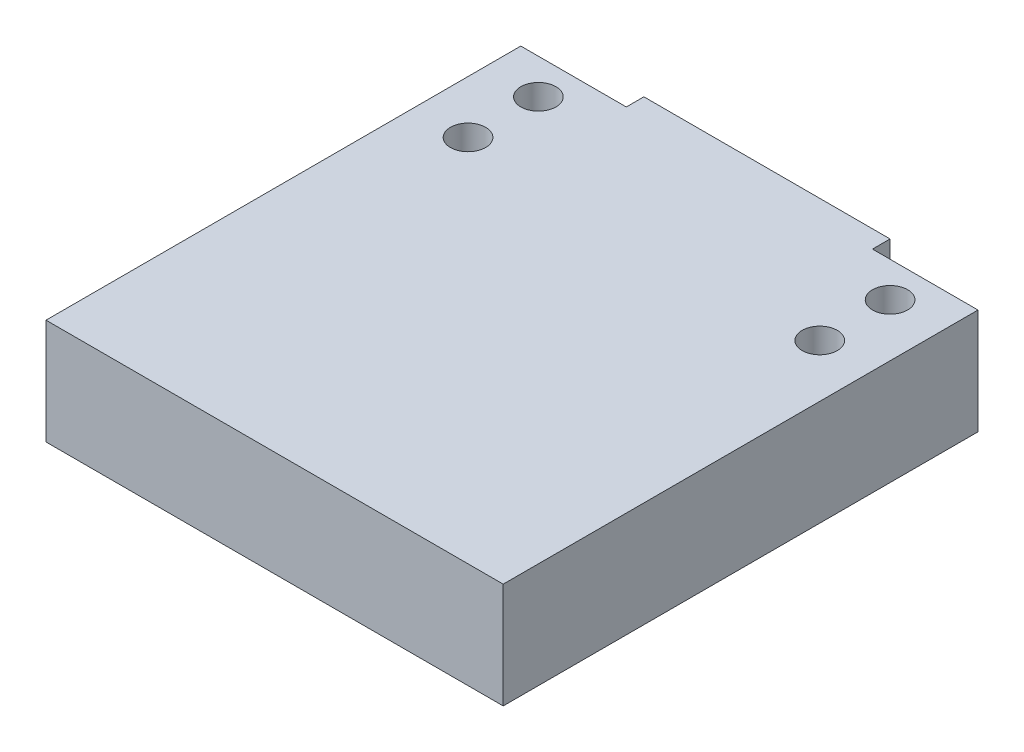
ISO-10303-21;
HEADER;
FILE_DESCRIPTION(('STEP AP214'),'2;1');
FILE_NAME('part.step','',(''),(''),'','','');
FILE_SCHEMA(('AUTOMOTIVE_DESIGN { 1 0 10303 214 1 1 1 1 }'));
ENDSEC;
DATA;
#1=APPLICATION_CONTEXT('core data for automotive mechanical design processes');
#2=APPLICATION_PROTOCOL_DEFINITION('international standard','automotive_design',2000,#1);
#3=PRODUCT_CONTEXT('',#1,'mechanical');
#4=PRODUCT('Part','Part','',(#3));
#5=PRODUCT_RELATED_PRODUCT_CATEGORY('part','',(#4));
#6=PRODUCT_DEFINITION_FORMATION('','',#4);
#7=PRODUCT_DEFINITION_CONTEXT('part definition',#1,'design');
#8=PRODUCT_DEFINITION('design','',#6,#7);
#9=PRODUCT_DEFINITION_SHAPE('','',#8);
#10=(LENGTH_UNIT() NAMED_UNIT(*) SI_UNIT(.MILLI.,.METRE.));
#11=(NAMED_UNIT(*) PLANE_ANGLE_UNIT() SI_UNIT($,.RADIAN.));
#12=(NAMED_UNIT(*) SI_UNIT($,.STERADIAN.) SOLID_ANGLE_UNIT());
#13=UNCERTAINTY_MEASURE_WITH_UNIT(LENGTH_MEASURE(1.E-05),#10,'distance_accuracy_value','');
#14=(GEOMETRIC_REPRESENTATION_CONTEXT(3) GLOBAL_UNCERTAINTY_ASSIGNED_CONTEXT((#13)) GLOBAL_UNIT_ASSIGNED_CONTEXT((#10,
#11,#12)) REPRESENTATION_CONTEXT('',''));
#15=CARTESIAN_POINT('',(0.,0.,0.));
#16=DIRECTION('',(0.,0.,1.));
#17=DIRECTION('',(1.,0.,0.));
#18=AXIS2_PLACEMENT_3D('',#15,#16,#17);
#19=CARTESIAN_POINT('',(0.,6.,0.));
#20=DIRECTION('',(1.,0.,0.));
#21=DIRECTION('',(0.,0.,-1.));
#22=AXIS2_PLACEMENT_3D('',#19,#20,#21);
#23=PLANE('',#22);
#24=DIRECTION('',(0.,0.,1.));
#25=VECTOR('',#24,1.);
#26=CARTESIAN_POINT('',(0.,0.,0.));
#27=LINE('',#26,#25);
#28=CARTESIAN_POINT('',(0.,0.,-27.));
#29=VERTEX_POINT('',#28);
#30=CARTESIAN_POINT('',(0.,0.,0.));
#31=VERTEX_POINT('',#30);
#32=EDGE_CURVE('E131',#29,#31,#27,.T.);
#33=ORIENTED_EDGE('',*,*,#32,.T.);
#34=DIRECTION('',(0.,-1.,0.));
#35=VECTOR('',#34,1.);
#36=CARTESIAN_POINT('',(0.,6.,0.));
#37=LINE('',#36,#35);
#38=CARTESIAN_POINT('',(0.,6.,0.));
#39=VERTEX_POINT('',#38);
#40=EDGE_CURVE('E11',#39,#31,#37,.T.);
#41=ORIENTED_EDGE('',*,*,#40,.F.);
#42=DIRECTION('',(0.,0.,1.));
#43=VECTOR('',#42,1.);
#44=CARTESIAN_POINT('',(0.,6.,0.));
#45=LINE('',#44,#43);
#46=CARTESIAN_POINT('',(0.,6.,-27.));
#47=VERTEX_POINT('',#46);
#48=EDGE_CURVE('E146',#47,#39,#45,.T.);
#49=ORIENTED_EDGE('',*,*,#48,.F.);
#50=DIRECTION('',(0.,-1.,0.));
#51=VECTOR('',#50,1.);
#52=CARTESIAN_POINT('',(0.,6.,-27.));
#53=LINE('',#52,#51);
#54=EDGE_CURVE('E127',#47,#29,#53,.T.);
#55=ORIENTED_EDGE('',*,*,#54,.T.);
#56=EDGE_LOOP('',(#33,#41,#49,#55));
#57=FACE_BOUND('',#56,.T.);
#58=ADVANCED_FACE('F35',(#57),#23,.F.);
#59=CARTESIAN_POINT('',(0.,6.,0.));
#60=DIRECTION('',(0.,0.,-1.));
#61=DIRECTION('',(-1.,0.,0.));
#62=AXIS2_PLACEMENT_3D('',#59,#60,#61);
#63=PLANE('',#62);
#64=DIRECTION('',(1.,0.,0.));
#65=VECTOR('',#64,1.);
#66=CARTESIAN_POINT('',(0.,0.,0.));
#67=LINE('',#66,#65);
#68=CARTESIAN_POINT('',(26.,0.,0.));
#69=VERTEX_POINT('',#68);
#70=EDGE_CURVE('E134',#31,#69,#67,.T.);
#71=ORIENTED_EDGE('',*,*,#70,.T.);
#72=DIRECTION('',(0.,-1.,0.));
#73=VECTOR('',#72,1.);
#74=CARTESIAN_POINT('',(26.,6.,0.));
#75=LINE('',#74,#73);
#76=CARTESIAN_POINT('',(26.,6.,0.));
#77=VERTEX_POINT('',#76);
#78=EDGE_CURVE('E43',#77,#69,#75,.T.);
#79=ORIENTED_EDGE('',*,*,#78,.F.);
#80=DIRECTION('',(1.,0.,0.));
#81=VECTOR('',#80,1.);
#82=CARTESIAN_POINT('',(0.,6.,0.));
#83=LINE('',#82,#81);
#84=EDGE_CURVE('E94',#39,#77,#83,.T.);
#85=ORIENTED_EDGE('',*,*,#84,.F.);
#86=ORIENTED_EDGE('',*,*,#40,.T.);
#87=EDGE_LOOP('',(#71,#79,#85,#86));
#88=FACE_BOUND('',#87,.T.);
#89=ADVANCED_FACE('F236',(#88),#63,.F.);
#90=CARTESIAN_POINT('',(26.,6.,0.));
#91=DIRECTION('',(-1.,0.,0.));
#92=DIRECTION('',(0.,0.,1.));
#93=AXIS2_PLACEMENT_3D('',#90,#91,#92);
#94=PLANE('',#93);
#95=DIRECTION('',(0.,0.,-1.));
#96=VECTOR('',#95,1.);
#97=CARTESIAN_POINT('',(26.,0.,0.));
#98=LINE('',#97,#96);
#99=CARTESIAN_POINT('',(26.,0.,-27.));
#100=VERTEX_POINT('',#99);
#101=EDGE_CURVE('E137',#69,#100,#98,.T.);
#102=ORIENTED_EDGE('',*,*,#101,.T.);
#103=DIRECTION('',(0.,-1.,0.));
#104=VECTOR('',#103,1.);
#105=CARTESIAN_POINT('',(26.,6.,-27.));
#106=LINE('',#105,#104);
#107=CARTESIAN_POINT('',(26.,6.,-27.));
#108=VERTEX_POINT('',#107);
#109=EDGE_CURVE('E153',#108,#100,#106,.T.);
#110=ORIENTED_EDGE('',*,*,#109,.F.);
#111=DIRECTION('',(0.,0.,-1.));
#112=VECTOR('',#111,1.);
#113=CARTESIAN_POINT('',(26.,6.,0.));
#114=LINE('',#113,#112);
#115=EDGE_CURVE('E161',#77,#108,#114,.T.);
#116=ORIENTED_EDGE('',*,*,#115,.F.);
#117=ORIENTED_EDGE('',*,*,#78,.T.);
#118=EDGE_LOOP('',(#102,#110,#116,#117));
#119=FACE_BOUND('',#118,.T.);
#120=ADVANCED_FACE('F159',(#119),#94,.F.);
#121=CARTESIAN_POINT('',(20.,6.,-27.));
#122=DIRECTION('',(0.,0.,1.));
#123=DIRECTION('',(1.,0.,0.));
#124=AXIS2_PLACEMENT_3D('',#121,#122,#123);
#125=PLANE('',#124);
#126=DIRECTION('',(-1.,0.,0.));
#127=VECTOR('',#126,1.);
#128=CARTESIAN_POINT('',(20.,0.,-27.));
#129=LINE('',#128,#127);
#130=CARTESIAN_POINT('',(20.,0.,-27.));
#131=VERTEX_POINT('',#130);
#132=EDGE_CURVE('E139',#100,#131,#129,.T.);
#133=ORIENTED_EDGE('',*,*,#132,.T.);
#134=DIRECTION('',(0.,-1.,0.));
#135=VECTOR('',#134,1.);
#136=CARTESIAN_POINT('',(20.,6.,-27.));
#137=LINE('',#136,#135);
#138=CARTESIAN_POINT('',(20.,6.,-27.));
#139=VERTEX_POINT('',#138);
#140=EDGE_CURVE('E150',#139,#131,#137,.T.);
#141=ORIENTED_EDGE('',*,*,#140,.F.);
#142=DIRECTION('',(-1.,0.,0.));
#143=VECTOR('',#142,1.);
#144=CARTESIAN_POINT('',(20.,6.,-27.));
#145=LINE('',#144,#143);
#146=EDGE_CURVE('E173',#108,#139,#145,.T.);
#147=ORIENTED_EDGE('',*,*,#146,.F.);
#148=ORIENTED_EDGE('',*,*,#109,.T.);
#149=EDGE_LOOP('',(#133,#141,#147,#148));
#150=FACE_BOUND('',#149,.T.);
#151=ADVANCED_FACE('F169',(#150),#125,.F.);
#152=CARTESIAN_POINT('',(20.,6.,-28.));
#153=DIRECTION('',(-1.,0.,0.));
#154=DIRECTION('',(0.,0.,1.));
#155=AXIS2_PLACEMENT_3D('',#152,#153,#154);
#156=PLANE('',#155);
#157=DIRECTION('',(0.,0.,-1.));
#158=VECTOR('',#157,1.);
#159=CARTESIAN_POINT('',(20.,0.,-28.));
#160=LINE('',#159,#158);
#161=CARTESIAN_POINT('',(20.,0.,-28.));
#162=VERTEX_POINT('',#161);
#163=EDGE_CURVE('E141',#131,#162,#160,.T.);
#164=ORIENTED_EDGE('',*,*,#163,.T.);
#165=DIRECTION('',(0.,-1.,0.));
#166=VECTOR('',#165,1.);
#167=CARTESIAN_POINT('',(20.,6.,-28.));
#168=LINE('',#167,#166);
#169=CARTESIAN_POINT('',(20.,6.,-28.));
#170=VERTEX_POINT('',#169);
#171=EDGE_CURVE('E122',#170,#162,#168,.T.);
#172=ORIENTED_EDGE('',*,*,#171,.F.);
#173=DIRECTION('',(0.,0.,-1.));
#174=VECTOR('',#173,1.);
#175=CARTESIAN_POINT('',(20.,6.,-28.));
#176=LINE('',#175,#174);
#177=EDGE_CURVE('E113',#139,#170,#176,.T.);
#178=ORIENTED_EDGE('',*,*,#177,.F.);
#179=ORIENTED_EDGE('',*,*,#140,.T.);
#180=EDGE_LOOP('',(#164,#172,#178,#179));
#181=FACE_BOUND('',#180,.T.);
#182=ADVANCED_FACE('F172',(#181),#156,.F.);
#183=CARTESIAN_POINT('',(6.,6.,-28.));
#184=DIRECTION('',(0.,0.,1.));
#185=DIRECTION('',(1.,0.,0.));
#186=AXIS2_PLACEMENT_3D('',#183,#184,#185);
#187=PLANE('',#186);
#188=DIRECTION('',(-1.,0.,0.));
#189=VECTOR('',#188,1.);
#190=CARTESIAN_POINT('',(6.,0.,-28.));
#191=LINE('',#190,#189);
#192=CARTESIAN_POINT('',(6.,0.,-28.));
#193=VERTEX_POINT('',#192);
#194=EDGE_CURVE('E121',#162,#193,#191,.T.);
#195=ORIENTED_EDGE('',*,*,#194,.T.);
#196=DIRECTION('',(0.,-1.,0.));
#197=VECTOR('',#196,1.);
#198=CARTESIAN_POINT('',(6.,6.,-28.));
#199=LINE('',#198,#197);
#200=CARTESIAN_POINT('',(6.,6.,-28.));
#201=VERTEX_POINT('',#200);
#202=EDGE_CURVE('E118',#201,#193,#199,.T.);
#203=ORIENTED_EDGE('',*,*,#202,.F.);
#204=DIRECTION('',(-1.,0.,0.));
#205=VECTOR('',#204,1.);
#206=CARTESIAN_POINT('',(6.,6.,-28.));
#207=LINE('',#206,#205);
#208=EDGE_CURVE('E107',#170,#201,#207,.T.);
#209=ORIENTED_EDGE('',*,*,#208,.F.);
#210=ORIENTED_EDGE('',*,*,#171,.T.);
#211=EDGE_LOOP('',(#195,#203,#209,#210));
#212=FACE_BOUND('',#211,.T.);
#213=ADVANCED_FACE('F119',(#212),#187,.F.);
#214=CARTESIAN_POINT('',(6.,6.,-27.));
#215=DIRECTION('',(1.,0.,0.));
#216=DIRECTION('',(0.,0.,-1.));
#217=AXIS2_PLACEMENT_3D('',#214,#215,#216);
#218=PLANE('',#217);
#219=DIRECTION('',(0.,0.,1.));
#220=VECTOR('',#219,1.);
#221=CARTESIAN_POINT('',(6.,0.,-27.));
#222=LINE('',#221,#220);
#223=CARTESIAN_POINT('',(6.,0.,-27.));
#224=VERTEX_POINT('',#223);
#225=EDGE_CURVE('E80',#193,#224,#222,.T.);
#226=ORIENTED_EDGE('',*,*,#225,.T.);
#227=DIRECTION('',(0.,-1.,0.));
#228=VECTOR('',#227,1.);
#229=CARTESIAN_POINT('',(6.,6.,-27.));
#230=LINE('',#229,#228);
#231=CARTESIAN_POINT('',(6.,6.,-27.));
#232=VERTEX_POINT('',#231);
#233=EDGE_CURVE('E123',#232,#224,#230,.T.);
#234=ORIENTED_EDGE('',*,*,#233,.F.);
#235=DIRECTION('',(0.,0.,1.));
#236=VECTOR('',#235,1.);
#237=CARTESIAN_POINT('',(6.,6.,-27.));
#238=LINE('',#237,#236);
#239=EDGE_CURVE('E111',#201,#232,#238,.T.);
#240=ORIENTED_EDGE('',*,*,#239,.F.);
#241=ORIENTED_EDGE('',*,*,#202,.T.);
#242=EDGE_LOOP('',(#226,#234,#240,#241));
#243=FACE_BOUND('',#242,.T.);
#244=ADVANCED_FACE('F125',(#243),#218,.F.);
#245=CARTESIAN_POINT('',(0.,6.,-27.));
#246=DIRECTION('',(0.,0.,1.));
#247=DIRECTION('',(1.,0.,0.));
#248=AXIS2_PLACEMENT_3D('',#245,#246,#247);
#249=PLANE('',#248);
#250=DIRECTION('',(-1.,0.,0.));
#251=VECTOR('',#250,1.);
#252=CARTESIAN_POINT('',(0.,0.,-27.));
#253=LINE('',#252,#251);
#254=EDGE_CURVE('E86',#224,#29,#253,.T.);
#255=ORIENTED_EDGE('',*,*,#254,.T.);
#256=ORIENTED_EDGE('',*,*,#54,.F.);
#257=DIRECTION('',(-1.,0.,0.));
#258=VECTOR('',#257,1.);
#259=CARTESIAN_POINT('',(0.,6.,-27.));
#260=LINE('',#259,#258);
#261=EDGE_CURVE('E51',#232,#47,#260,.T.);
#262=ORIENTED_EDGE('',*,*,#261,.F.);
#263=ORIENTED_EDGE('',*,*,#233,.T.);
#264=EDGE_LOOP('',(#255,#256,#262,#263));
#265=FACE_BOUND('',#264,.T.);
#266=ADVANCED_FACE('F214',(#265),#249,.F.);
#267=CARTESIAN_POINT('',(0.,6.,0.));
#268=DIRECTION('',(0.,-1.,0.));
#269=DIRECTION('',(0.,0.,-1.));
#270=AXIS2_PLACEMENT_3D('',#267,#268,#269);
#271=PLANE('',#270);
#272=CARTESIAN_POINT('',(23.,6.,-21.));
#273=DIRECTION('',(0.,1.,0.));
#274=DIRECTION('',(0.,0.,1.));
#275=AXIS2_PLACEMENT_3D('',#272,#273,#274);
#276=CIRCLE('',#275,1.);
#277=CARTESIAN_POINT('',(23.,6.,-20.));
#278=VERTEX_POINT('',#277);
#279=EDGE_CURVE('E197',#278,#278,#276,.T.);
#280=ORIENTED_EDGE('',*,*,#279,.F.);
#281=EDGE_LOOP('',(#280));
#282=FACE_BOUND('',#281,.T.);
#283=CARTESIAN_POINT('',(3.,6.,-21.));
#284=DIRECTION('',(0.,1.,0.));
#285=DIRECTION('',(0.,0.,1.));
#286=AXIS2_PLACEMENT_3D('',#283,#284,#285);
#287=CIRCLE('',#286,1.);
#288=CARTESIAN_POINT('',(3.,6.,-20.));
#289=VERTEX_POINT('',#288);
#290=EDGE_CURVE('E191',#289,#289,#287,.T.);
#291=ORIENTED_EDGE('',*,*,#290,.F.);
#292=EDGE_LOOP('',(#291));
#293=FACE_BOUND('',#292,.T.);
#294=CARTESIAN_POINT('',(23.,6.,-25.));
#295=DIRECTION('',(0.,1.,0.));
#296=DIRECTION('',(0.,0.,1.));
#297=AXIS2_PLACEMENT_3D('',#294,#295,#296);
#298=CIRCLE('',#297,1.);
#299=CARTESIAN_POINT('',(23.,6.,-24.));
#300=VERTEX_POINT('',#299);
#301=EDGE_CURVE('E185',#300,#300,#298,.T.);
#302=ORIENTED_EDGE('',*,*,#301,.F.);
#303=EDGE_LOOP('',(#302));
#304=FACE_BOUND('',#303,.T.);
#305=CARTESIAN_POINT('',(3.,6.,-25.));
#306=DIRECTION('',(0.,1.,0.));
#307=DIRECTION('',(0.,0.,1.));
#308=AXIS2_PLACEMENT_3D('',#305,#306,#307);
#309=CIRCLE('',#308,1.);
#310=CARTESIAN_POINT('',(3.,6.,-24.));
#311=VERTEX_POINT('',#310);
#312=EDGE_CURVE('E179',#311,#311,#309,.T.);
#313=ORIENTED_EDGE('',*,*,#312,.F.);
#314=EDGE_LOOP('',(#313));
#315=FACE_BOUND('',#314,.T.);
#316=ORIENTED_EDGE('',*,*,#48,.T.);
#317=ORIENTED_EDGE('',*,*,#84,.T.);
#318=ORIENTED_EDGE('',*,*,#115,.T.);
#319=ORIENTED_EDGE('',*,*,#146,.T.);
#320=ORIENTED_EDGE('',*,*,#177,.T.);
#321=ORIENTED_EDGE('',*,*,#208,.T.);
#322=ORIENTED_EDGE('',*,*,#239,.T.);
#323=ORIENTED_EDGE('',*,*,#261,.T.);
#324=EDGE_LOOP('',(#316,#317,#318,#319,#320,#321,#322,#323));
#325=FACE_BOUND('',#324,.T.);
#326=ADVANCED_FACE('F109',(#282,#293,#304,#315,#325),#271,.F.);
#327=CARTESIAN_POINT('',(0.,0.,0.));
#328=DIRECTION('',(0.,-1.,0.));
#329=DIRECTION('',(0.,0.,-1.));
#330=AXIS2_PLACEMENT_3D('',#327,#328,#329);
#331=PLANE('',#330);
#332=CARTESIAN_POINT('',(23.,0.,-21.));
#333=DIRECTION('',(0.,1.,0.));
#334=DIRECTION('',(0.,0.,1.));
#335=AXIS2_PLACEMENT_3D('',#332,#333,#334);
#336=CIRCLE('',#335,1.);
#337=CARTESIAN_POINT('',(23.,0.,-20.));
#338=VERTEX_POINT('',#337);
#339=EDGE_CURVE('E194',#338,#338,#336,.T.);
#340=ORIENTED_EDGE('',*,*,#339,.T.);
#341=EDGE_LOOP('',(#340));
#342=FACE_BOUND('',#341,.T.);
#343=CARTESIAN_POINT('',(3.,0.,-21.));
#344=DIRECTION('',(0.,1.,0.));
#345=DIRECTION('',(0.,0.,1.));
#346=AXIS2_PLACEMENT_3D('',#343,#344,#345);
#347=CIRCLE('',#346,1.);
#348=CARTESIAN_POINT('',(3.,0.,-20.));
#349=VERTEX_POINT('',#348);
#350=EDGE_CURVE('E188',#349,#349,#347,.T.);
#351=ORIENTED_EDGE('',*,*,#350,.T.);
#352=EDGE_LOOP('',(#351));
#353=FACE_BOUND('',#352,.T.);
#354=CARTESIAN_POINT('',(23.,0.,-25.));
#355=DIRECTION('',(0.,1.,0.));
#356=DIRECTION('',(0.,0.,1.));
#357=AXIS2_PLACEMENT_3D('',#354,#355,#356);
#358=CIRCLE('',#357,1.);
#359=CARTESIAN_POINT('',(23.,0.,-24.));
#360=VERTEX_POINT('',#359);
#361=EDGE_CURVE('E182',#360,#360,#358,.T.);
#362=ORIENTED_EDGE('',*,*,#361,.T.);
#363=EDGE_LOOP('',(#362));
#364=FACE_BOUND('',#363,.T.);
#365=CARTESIAN_POINT('',(3.,0.,-25.));
#366=DIRECTION('',(0.,1.,0.));
#367=DIRECTION('',(0.,0.,1.));
#368=AXIS2_PLACEMENT_3D('',#365,#366,#367);
#369=CIRCLE('',#368,1.);
#370=CARTESIAN_POINT('',(3.,0.,-24.));
#371=VERTEX_POINT('',#370);
#372=EDGE_CURVE('E135',#371,#371,#369,.T.);
#373=ORIENTED_EDGE('',*,*,#372,.T.);
#374=EDGE_LOOP('',(#373));
#375=FACE_BOUND('',#374,.T.);
#376=ORIENTED_EDGE('',*,*,#32,.F.);
#377=ORIENTED_EDGE('',*,*,#254,.F.);
#378=ORIENTED_EDGE('',*,*,#225,.F.);
#379=ORIENTED_EDGE('',*,*,#194,.F.);
#380=ORIENTED_EDGE('',*,*,#163,.F.);
#381=ORIENTED_EDGE('',*,*,#132,.F.);
#382=ORIENTED_EDGE('',*,*,#101,.F.);
#383=ORIENTED_EDGE('',*,*,#70,.F.);
#384=EDGE_LOOP('',(#376,#377,#378,#379,#380,#381,#382,#383));
#385=FACE_BOUND('',#384,.T.);
#386=ADVANCED_FACE('F165',(#342,#353,#364,#375,#385),#331,.T.);
#387=CARTESIAN_POINT('',(3.,0.,-25.));
#388=DIRECTION('',(0.,1.,0.));
#389=DIRECTION('',(0.,0.,1.));
#390=AXIS2_PLACEMENT_3D('',#387,#388,#389);
#391=CYLINDRICAL_SURFACE('',#390,1.);
#392=ORIENTED_EDGE('',*,*,#372,.F.);
#393=EDGE_LOOP('',(#392));
#394=FACE_BOUND('',#393,.T.);
#395=ORIENTED_EDGE('',*,*,#312,.T.);
#396=EDGE_LOOP('',(#395));
#397=FACE_BOUND('',#396,.T.);
#398=ADVANCED_FACE('F222',(#394,#397),#391,.F.);
#399=CARTESIAN_POINT('',(23.,0.,-25.));
#400=DIRECTION('',(0.,1.,0.));
#401=DIRECTION('',(0.,0.,1.));
#402=AXIS2_PLACEMENT_3D('',#399,#400,#401);
#403=CYLINDRICAL_SURFACE('',#402,1.);
#404=ORIENTED_EDGE('',*,*,#361,.F.);
#405=EDGE_LOOP('',(#404));
#406=FACE_BOUND('',#405,.T.);
#407=ORIENTED_EDGE('',*,*,#301,.T.);
#408=EDGE_LOOP('',(#407));
#409=FACE_BOUND('',#408,.T.);
#410=ADVANCED_FACE('F224',(#406,#409),#403,.F.);
#411=CARTESIAN_POINT('',(3.,0.,-21.));
#412=DIRECTION('',(0.,1.,0.));
#413=DIRECTION('',(0.,0.,1.));
#414=AXIS2_PLACEMENT_3D('',#411,#412,#413);
#415=CYLINDRICAL_SURFACE('',#414,1.);
#416=ORIENTED_EDGE('',*,*,#350,.F.);
#417=EDGE_LOOP('',(#416));
#418=FACE_BOUND('',#417,.T.);
#419=ORIENTED_EDGE('',*,*,#290,.T.);
#420=EDGE_LOOP('',(#419));
#421=FACE_BOUND('',#420,.T.);
#422=ADVANCED_FACE('F208',(#418,#421),#415,.F.);
#423=CARTESIAN_POINT('',(23.,0.,-21.));
#424=DIRECTION('',(0.,1.,0.));
#425=DIRECTION('',(0.,0.,1.));
#426=AXIS2_PLACEMENT_3D('',#423,#424,#425);
#427=CYLINDRICAL_SURFACE('',#426,1.);
#428=ORIENTED_EDGE('',*,*,#339,.F.);
#429=EDGE_LOOP('',(#428));
#430=FACE_BOUND('',#429,.T.);
#431=ORIENTED_EDGE('',*,*,#279,.T.);
#432=EDGE_LOOP('',(#431));
#433=FACE_BOUND('',#432,.T.);
#434=ADVANCED_FACE('F205',(#430,#433),#427,.F.);
#435=CLOSED_SHELL('',(#58,#89,#120,#151,#182,#213,#244,#266,#326,#386,#398,#410,#422,#434));
#436=MANIFOLD_SOLID_BREP('B2',#435);
#437=ADVANCED_BREP_SHAPE_REPRESENTATION('',(#18,#436),#14);
#438=SHAPE_DEFINITION_REPRESENTATION(#9,#437);
ENDSEC;
END-ISO-10303-21;
